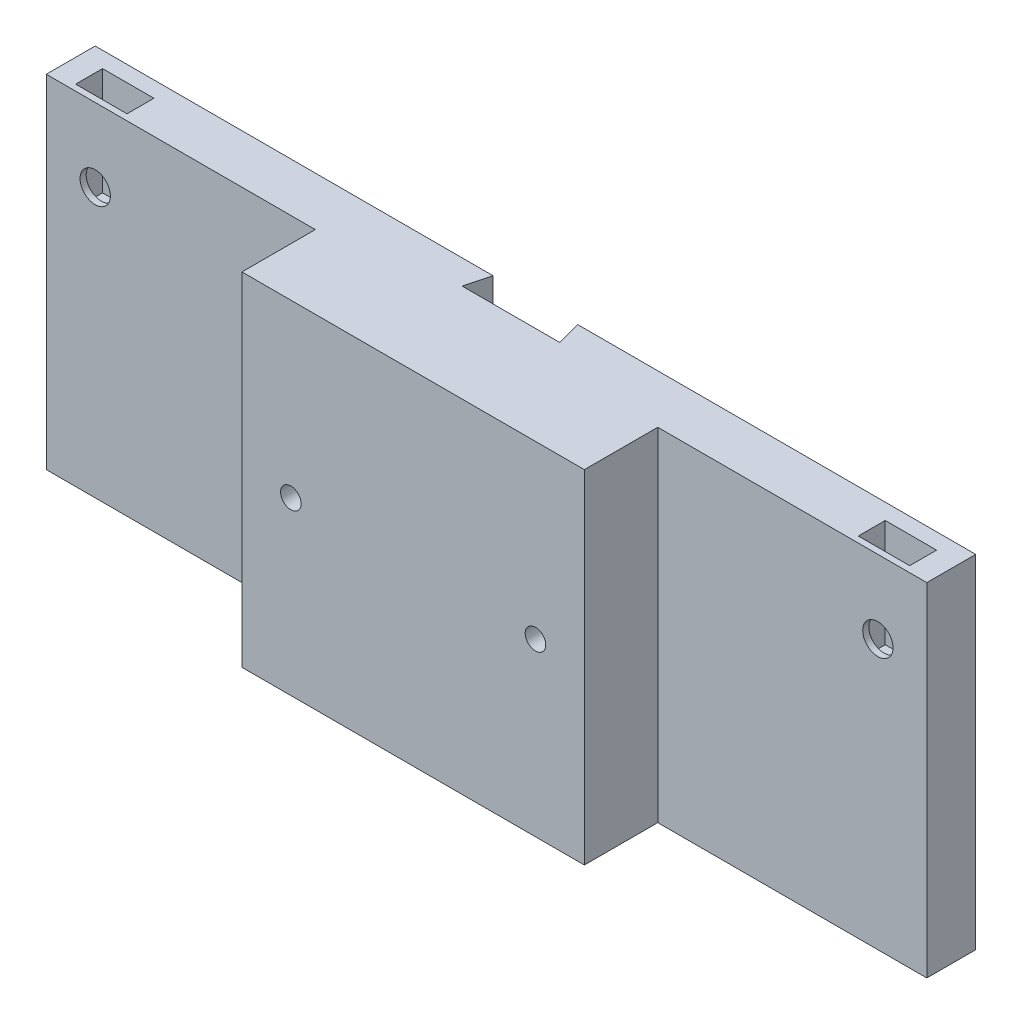
ISO-10303-21;
HEADER;
FILE_DESCRIPTION(('STEP AP214'),'2;1');
FILE_NAME('part.step','',(''),(''),'','','');
FILE_SCHEMA(('AUTOMOTIVE_DESIGN { 1 0 10303 214 1 1 1 1 }'));
ENDSEC;
DATA;
#1=APPLICATION_CONTEXT('core data for automotive mechanical design processes');
#2=APPLICATION_PROTOCOL_DEFINITION('international standard','automotive_design',2000,#1);
#3=PRODUCT_CONTEXT('',#1,'mechanical');
#4=PRODUCT('Part','Part','',(#3));
#5=PRODUCT_RELATED_PRODUCT_CATEGORY('part','',(#4));
#6=PRODUCT_DEFINITION_FORMATION('','',#4);
#7=PRODUCT_DEFINITION_CONTEXT('part definition',#1,'design');
#8=PRODUCT_DEFINITION('design','',#6,#7);
#9=PRODUCT_DEFINITION_SHAPE('','',#8);
#10=(LENGTH_UNIT() NAMED_UNIT(*) SI_UNIT(.MILLI.,.METRE.));
#11=(NAMED_UNIT(*) PLANE_ANGLE_UNIT() SI_UNIT($,.RADIAN.));
#12=(NAMED_UNIT(*) SI_UNIT($,.STERADIAN.) SOLID_ANGLE_UNIT());
#13=UNCERTAINTY_MEASURE_WITH_UNIT(LENGTH_MEASURE(1.E-05),#10,'distance_accuracy_value','');
#14=(GEOMETRIC_REPRESENTATION_CONTEXT(3) GLOBAL_UNCERTAINTY_ASSIGNED_CONTEXT((#13)) GLOBAL_UNIT_ASSIGNED_CONTEXT((#10,
#11,#12)) REPRESENTATION_CONTEXT('',''));
#15=CARTESIAN_POINT('',(0.,0.,0.));
#16=DIRECTION('',(0.,0.,1.));
#17=DIRECTION('',(1.,0.,0.));
#18=AXIS2_PLACEMENT_3D('',#15,#16,#17);
#19=CARTESIAN_POINT('',(80.,20.,25.));
#20=DIRECTION('',(0.,0.,-1.));
#21=DIRECTION('',(-1.,0.,0.));
#22=AXIS2_PLACEMENT_3D('',#19,#20,#21);
#23=CYLINDRICAL_SURFACE('',#22,3.09999999999999);
#24=CARTESIAN_POINT('',(80.,20.,3.25));
#25=DIRECTION('',(0.,0.,-1.));
#26=DIRECTION('',(-1.,0.,0.));
#27=AXIS2_PLACEMENT_3D('',#24,#25,#26);
#28=CIRCLE('',#27,3.09999999999999);
#29=CARTESIAN_POINT('',(76.9,20.,3.25));
#30=VERTEX_POINT('',#29);
#31=EDGE_CURVE('E329',#30,#30,#28,.T.);
#32=ORIENTED_EDGE('',*,*,#31,.F.);
#33=EDGE_LOOP('',(#32));
#34=FACE_BOUND('',#33,.T.);
#35=CARTESIAN_POINT('',(80.,20.,2.3));
#36=DIRECTION('',(0.,0.,-1.));
#37=DIRECTION('',(-1.,0.,0.));
#38=AXIS2_PLACEMENT_3D('',#35,#36,#37);
#39=CIRCLE('',#38,3.09999999999999);
#40=CARTESIAN_POINT('',(76.9,20.,2.3));
#41=VERTEX_POINT('',#40);
#42=EDGE_CURVE('E236',#41,#41,#39,.T.);
#43=ORIENTED_EDGE('',*,*,#42,.T.);
#44=EDGE_LOOP('',(#43));
#45=FACE_BOUND('',#44,.T.);
#46=ADVANCED_FACE('F38',(#34,#45),#23,.F.);
#47=CARTESIAN_POINT('',(-80.,20.,25.));
#48=DIRECTION('',(0.,0.,-1.));
#49=DIRECTION('',(-1.,0.,0.));
#50=AXIS2_PLACEMENT_3D('',#47,#48,#49);
#51=CYLINDRICAL_SURFACE('',#50,3.09999999999999);
#52=CARTESIAN_POINT('',(-80.,20.,2.3));
#53=DIRECTION('',(0.,0.,1.));
#54=DIRECTION('',(1.,0.,0.));
#55=AXIS2_PLACEMENT_3D('',#52,#53,#54);
#56=CIRCLE('',#55,3.09999999999999);
#57=CARTESIAN_POINT('',(-76.9,20.,2.3));
#58=VERTEX_POINT('',#57);
#59=EDGE_CURVE('E42',#58,#58,#56,.T.);
#60=ORIENTED_EDGE('',*,*,#59,.F.);
#61=EDGE_LOOP('',(#60));
#62=FACE_BOUND('',#61,.T.);
#63=CARTESIAN_POINT('',(-80.,20.,3.25000000000002));
#64=DIRECTION('',(0.,0.,-1.));
#65=DIRECTION('',(-1.,0.,0.));
#66=AXIS2_PLACEMENT_3D('',#63,#64,#65);
#67=CIRCLE('',#66,3.09999999999999);
#68=CARTESIAN_POINT('',(-83.1,20.,3.25000000000002));
#69=VERTEX_POINT('',#68);
#70=EDGE_CURVE('E328',#69,#69,#67,.T.);
#71=ORIENTED_EDGE('',*,*,#70,.F.);
#72=EDGE_LOOP('',(#71));
#73=FACE_BOUND('',#72,.T.);
#74=ADVANCED_FACE('F437',(#62,#73),#51,.F.);
#75=CARTESIAN_POINT('',(-90.,35.,25.));
#76=DIRECTION('',(1.,0.,0.));
#77=DIRECTION('',(0.,0.,-1.));
#78=AXIS2_PLACEMENT_3D('',#75,#76,#77);
#79=PLANE('',#78);
#80=DIRECTION('',(0.,-1.,0.));
#81=VECTOR('',#80,1.);
#82=CARTESIAN_POINT('',(-90.,35.,10.));
#83=LINE('',#82,#81);
#84=CARTESIAN_POINT('',(-90.,35.,10.));
#85=VERTEX_POINT('',#84);
#86=CARTESIAN_POINT('',(-90.,-35.,10.));
#87=VERTEX_POINT('',#86);
#88=EDGE_CURVE('E356',#85,#87,#83,.T.);
#89=ORIENTED_EDGE('',*,*,#88,.F.);
#90=DIRECTION('',(0.,0.,-1.));
#91=VECTOR('',#90,1.);
#92=CARTESIAN_POINT('',(-90.,35.,25.));
#93=LINE('',#92,#91);
#94=CARTESIAN_POINT('',(-90.,35.,0.));
#95=VERTEX_POINT('',#94);
#96=EDGE_CURVE('E396',#85,#95,#93,.T.);
#97=ORIENTED_EDGE('',*,*,#96,.T.);
#98=DIRECTION('',(0.,-1.,0.));
#99=VECTOR('',#98,1.);
#100=CARTESIAN_POINT('',(-90.,35.,0.));
#101=LINE('',#100,#99);
#102=CARTESIAN_POINT('',(-90.,-35.,0.));
#103=VERTEX_POINT('',#102);
#104=EDGE_CURVE('E385',#95,#103,#101,.T.);
#105=ORIENTED_EDGE('',*,*,#104,.T.);
#106=DIRECTION('',(0.,0.,-1.));
#107=VECTOR('',#106,1.);
#108=CARTESIAN_POINT('',(-90.,-35.,25.));
#109=LINE('',#108,#107);
#110=EDGE_CURVE('E11',#87,#103,#109,.T.);
#111=ORIENTED_EDGE('',*,*,#110,.F.);
#112=EDGE_LOOP('',(#89,#97,#105,#111));
#113=FACE_BOUND('',#112,.T.);
#114=ADVANCED_FACE('F40',(#113),#79,.F.);
#115=CARTESIAN_POINT('',(-80.,20.,8.75000000000002));
#116=DIRECTION('',(0.,0.,1.));
#117=DIRECTION('',(1.,0.,0.));
#118=AXIS2_PLACEMENT_3D('',#115,#116,#117);
#119=CIRCLE('',#118,3.09999999999999);
#120=CARTESIAN_POINT('',(-76.9,20.,8.75000000000002));
#121=VERTEX_POINT('',#120);
#122=EDGE_CURVE('E325',#121,#121,#119,.T.);
#123=ORIENTED_EDGE('',*,*,#122,.F.);
#124=EDGE_LOOP('',(#123));
#125=FACE_BOUND('',#124,.T.);
#126=CARTESIAN_POINT('',(-80.,20.,10.));
#127=DIRECTION('',(0.,0.,1.));
#128=DIRECTION('',(1.,0.,0.));
#129=AXIS2_PLACEMENT_3D('',#126,#127,#128);
#130=CIRCLE('',#129,3.09999999999999);
#131=CARTESIAN_POINT('',(-76.9,20.,10.));
#132=VERTEX_POINT('',#131);
#133=EDGE_CURVE('E353',#132,#132,#130,.T.);
#134=ORIENTED_EDGE('',*,*,#133,.T.);
#135=EDGE_LOOP('',(#134));
#136=FACE_BOUND('',#135,.T.);
#137=ADVANCED_FACE('F441',(#125,#136),#51,.F.);
#138=CARTESIAN_POINT('',(0.,0.,25.));
#139=DIRECTION('',(0.,0.,1.));
#140=DIRECTION('',(1.,0.,0.));
#141=AXIS2_PLACEMENT_3D('',#138,#139,#140);
#142=PLANE('',#141);
#143=DIRECTION('',(0.,-1.,0.));
#144=VECTOR('',#143,1.);
#145=CARTESIAN_POINT('',(35.,35.,25.));
#146=LINE('',#145,#144);
#147=CARTESIAN_POINT('',(35.,35.,25.));
#148=VERTEX_POINT('',#147);
#149=CARTESIAN_POINT('',(35.,-35.,25.));
#150=VERTEX_POINT('',#149);
#151=EDGE_CURVE('E337',#148,#150,#146,.T.);
#152=ORIENTED_EDGE('',*,*,#151,.F.);
#153=DIRECTION('',(-1.,0.,0.));
#154=VECTOR('',#153,1.);
#155=CARTESIAN_POINT('',(-90.,35.,25.));
#156=LINE('',#155,#154);
#157=CARTESIAN_POINT('',(-35.,35.,25.));
#158=VERTEX_POINT('',#157);
#159=EDGE_CURVE('E392',#148,#158,#156,.T.);
#160=ORIENTED_EDGE('',*,*,#159,.T.);
#161=DIRECTION('',(0.,1.,0.));
#162=VECTOR('',#161,1.);
#163=CARTESIAN_POINT('',(-35.,35.,25.));
#164=LINE('',#163,#162);
#165=CARTESIAN_POINT('',(-35.,-35.,25.));
#166=VERTEX_POINT('',#165);
#167=EDGE_CURVE('E332',#166,#158,#164,.T.);
#168=ORIENTED_EDGE('',*,*,#167,.F.);
#169=DIRECTION('',(1.,0.,0.));
#170=VECTOR('',#169,1.);
#171=CARTESIAN_POINT('',(-90.,-35.,25.));
#172=LINE('',#171,#170);
#173=EDGE_CURVE('E388',#166,#150,#172,.T.);
#174=ORIENTED_EDGE('',*,*,#173,.T.);
#175=EDGE_LOOP('',(#152,#160,#168,#174));
#176=FACE_BOUND('',#175,.T.);
#177=CARTESIAN_POINT('',(25.,0.,25.));
#178=DIRECTION('',(0.,0.,1.));
#179=DIRECTION('',(1.,0.,0.));
#180=AXIS2_PLACEMENT_3D('',#177,#178,#179);
#181=CIRCLE('',#180,2.1);
#182=CARTESIAN_POINT('',(27.1,0.,25.));
#183=VERTEX_POINT('',#182);
#184=EDGE_CURVE('E382',#183,#183,#181,.T.);
#185=ORIENTED_EDGE('',*,*,#184,.F.);
#186=EDGE_LOOP('',(#185));
#187=FACE_BOUND('',#186,.T.);
#188=CARTESIAN_POINT('',(-25.,0.,25.));
#189=DIRECTION('',(0.,0.,1.));
#190=DIRECTION('',(-1.,0.,0.));
#191=AXIS2_PLACEMENT_3D('',#188,#189,#190);
#192=CIRCLE('',#191,2.1);
#193=CARTESIAN_POINT('',(-27.1,0.,25.));
#194=VERTEX_POINT('',#193);
#195=EDGE_CURVE('E374',#194,#194,#192,.T.);
#196=ORIENTED_EDGE('',*,*,#195,.F.);
#197=EDGE_LOOP('',(#196));
#198=FACE_BOUND('',#197,.T.);
#199=ADVANCED_FACE('F577',(#176,#187,#198),#142,.T.);
#200=CARTESIAN_POINT('',(0.,0.,0.));
#201=DIRECTION('',(0.,0.,1.));
#202=DIRECTION('',(1.,0.,0.));
#203=AXIS2_PLACEMENT_3D('',#200,#201,#202);
#204=PLANE('',#203);
#205=CARTESIAN_POINT('',(80.,20.,0.));
#206=DIRECTION('',(0.,0.,-1.));
#207=DIRECTION('',(-1.,0.,0.));
#208=AXIS2_PLACEMENT_3D('',#205,#206,#207);
#209=CIRCLE('',#208,5.99999999999999);
#210=CARTESIAN_POINT('',(74.,20.,0.));
#211=VERTEX_POINT('',#210);
#212=EDGE_CURVE('E237',#211,#211,#209,.T.);
#213=ORIENTED_EDGE('',*,*,#212,.F.);
#214=EDGE_LOOP('',(#213));
#215=FACE_BOUND('',#214,.T.);
#216=CARTESIAN_POINT('',(-80.,20.,0.));
#217=DIRECTION('',(0.,0.,-1.));
#218=DIRECTION('',(1.,0.,0.));
#219=AXIS2_PLACEMENT_3D('',#216,#217,#218);
#220=CIRCLE('',#219,5.99999999999999);
#221=CARTESIAN_POINT('',(-74.,20.,0.));
#222=VERTEX_POINT('',#221);
#223=EDGE_CURVE('E228',#222,#222,#220,.T.);
#224=ORIENTED_EDGE('',*,*,#223,.F.);
#225=EDGE_LOOP('',(#224));
#226=FACE_BOUND('',#225,.T.);
#227=DIRECTION('',(-1.,0.,0.));
#228=VECTOR('',#227,1.);
#229=CARTESIAN_POINT('',(8.66025403784439,-25.,0.));
#230=LINE('',#229,#228);
#231=CARTESIAN_POINT('',(8.66025403784439,-25.,0.));
#232=VERTEX_POINT('',#231);
#233=CARTESIAN_POINT('',(-8.6602540378444,-25.,0.));
#234=VERTEX_POINT('',#233);
#235=EDGE_CURVE('E209',#232,#234,#230,.T.);
#236=ORIENTED_EDGE('',*,*,#235,.F.);
#237=DIRECTION('',(0.,1.,0.));
#238=VECTOR('',#237,1.);
#239=CARTESIAN_POINT('',(8.66025403784439,-25.,0.));
#240=LINE('',#239,#238);
#241=CARTESIAN_POINT('',(8.66025403784439,35.,0.));
#242=VERTEX_POINT('',#241);
#243=EDGE_CURVE('E192',#232,#242,#240,.T.);
#244=ORIENTED_EDGE('',*,*,#243,.T.);
#245=DIRECTION('',(-1.,0.,0.));
#246=VECTOR('',#245,1.);
#247=CARTESIAN_POINT('',(-90.,35.,0.));
#248=LINE('',#247,#246);
#249=CARTESIAN_POINT('',(90.,35.,0.));
#250=VERTEX_POINT('',#249);
#251=EDGE_CURVE('E393',#250,#242,#248,.T.);
#252=ORIENTED_EDGE('',*,*,#251,.F.);
#253=DIRECTION('',(0.,1.,0.));
#254=VECTOR('',#253,1.);
#255=CARTESIAN_POINT('',(90.,35.,0.));
#256=LINE('',#255,#254);
#257=CARTESIAN_POINT('',(90.,-35.,0.));
#258=VERTEX_POINT('',#257);
#259=EDGE_CURVE('E404',#258,#250,#256,.T.);
#260=ORIENTED_EDGE('',*,*,#259,.F.);
#261=DIRECTION('',(1.,0.,0.));
#262=VECTOR('',#261,1.);
#263=CARTESIAN_POINT('',(-90.,-35.,0.));
#264=LINE('',#263,#262);
#265=EDGE_CURVE('E400',#103,#258,#264,.T.);
#266=ORIENTED_EDGE('',*,*,#265,.F.);
#267=ORIENTED_EDGE('',*,*,#104,.F.);
#268=CARTESIAN_POINT('',(-8.66025403784443,35.,0.));
#269=VERTEX_POINT('',#268);
#270=EDGE_CURVE('E408',#269,#95,#248,.T.);
#271=ORIENTED_EDGE('',*,*,#270,.F.);
#272=DIRECTION('',(0.,1.,0.));
#273=VECTOR('',#272,1.);
#274=CARTESIAN_POINT('',(-8.6602540378444,-25.,0.));
#275=LINE('',#274,#273);
#276=EDGE_CURVE('E56',#234,#269,#275,.T.);
#277=ORIENTED_EDGE('',*,*,#276,.F.);
#278=EDGE_LOOP('',(#236,#244,#252,#260,#266,#267,#271,#277));
#279=FACE_BOUND('',#278,.T.);
#280=CARTESIAN_POINT('',(25.,0.,0.));
#281=DIRECTION('',(0.,0.,1.));
#282=DIRECTION('',(1.,0.,0.));
#283=AXIS2_PLACEMENT_3D('',#280,#281,#282);
#284=CIRCLE('',#283,2.1);
#285=CARTESIAN_POINT('',(27.1,0.,0.));
#286=VERTEX_POINT('',#285);
#287=EDGE_CURVE('E377',#286,#286,#284,.T.);
#288=ORIENTED_EDGE('',*,*,#287,.T.);
#289=EDGE_LOOP('',(#288));
#290=FACE_BOUND('',#289,.T.);
#291=CARTESIAN_POINT('',(-25.,0.,0.));
#292=DIRECTION('',(0.,0.,1.));
#293=DIRECTION('',(-1.,0.,0.));
#294=AXIS2_PLACEMENT_3D('',#291,#292,#293);
#295=CIRCLE('',#294,2.1);
#296=CARTESIAN_POINT('',(-27.1,0.,0.));
#297=VERTEX_POINT('',#296);
#298=EDGE_CURVE('E378',#297,#297,#295,.T.);
#299=ORIENTED_EDGE('',*,*,#298,.T.);
#300=EDGE_LOOP('',(#299));
#301=FACE_BOUND('',#300,.T.);
#302=ADVANCED_FACE('F213',(#215,#226,#279,#290,#301),#204,.F.);
#303=CARTESIAN_POINT('',(-90.,-35.,25.));
#304=DIRECTION('',(0.,1.,0.));
#305=DIRECTION('',(-1.,0.,0.));
#306=AXIS2_PLACEMENT_3D('',#303,#304,#305);
#307=PLANE('',#306);
#308=DIRECTION('',(1.,0.,0.));
#309=VECTOR('',#308,1.);
#310=CARTESIAN_POINT('',(90.,-35.,10.));
#311=LINE('',#310,#309);
#312=CARTESIAN_POINT('',(35.,-35.,10.));
#313=VERTEX_POINT('',#312);
#314=CARTESIAN_POINT('',(90.,-35.,10.));
#315=VERTEX_POINT('',#314);
#316=EDGE_CURVE('E345',#313,#315,#311,.T.);
#317=ORIENTED_EDGE('',*,*,#316,.F.);
#318=DIRECTION('',(0.,0.,1.));
#319=VECTOR('',#318,1.);
#320=CARTESIAN_POINT('',(35.,-35.,10.));
#321=LINE('',#320,#319);
#322=EDGE_CURVE('E350',#313,#150,#321,.T.);
#323=ORIENTED_EDGE('',*,*,#322,.T.);
#324=ORIENTED_EDGE('',*,*,#173,.F.);
#325=DIRECTION('',(0.,0.,1.));
#326=VECTOR('',#325,1.);
#327=CARTESIAN_POINT('',(-35.,-35.,10.));
#328=LINE('',#327,#326);
#329=CARTESIAN_POINT('',(-35.,-35.,10.));
#330=VERTEX_POINT('',#329);
#331=EDGE_CURVE('E367',#330,#166,#328,.T.);
#332=ORIENTED_EDGE('',*,*,#331,.F.);
#333=DIRECTION('',(1.,0.,0.));
#334=VECTOR('',#333,1.);
#335=CARTESIAN_POINT('',(-90.,-35.,10.));
#336=LINE('',#335,#334);
#337=EDGE_CURVE('E359',#87,#330,#336,.T.);
#338=ORIENTED_EDGE('',*,*,#337,.F.);
#339=ORIENTED_EDGE('',*,*,#110,.T.);
#340=ORIENTED_EDGE('',*,*,#265,.T.);
#341=DIRECTION('',(0.,0.,-1.));
#342=VECTOR('',#341,1.);
#343=CARTESIAN_POINT('',(90.,-35.,25.));
#344=LINE('',#343,#342);
#345=EDGE_CURVE('E48',#315,#258,#344,.T.);
#346=ORIENTED_EDGE('',*,*,#345,.F.);
#347=EDGE_LOOP('',(#317,#323,#324,#332,#338,#339,#340,#346));
#348=FACE_BOUND('',#347,.T.);
#349=ADVANCED_FACE('F597',(#348),#307,.F.);
#350=CARTESIAN_POINT('',(90.,35.,25.));
#351=DIRECTION('',(-1.,0.,0.));
#352=DIRECTION('',(0.,-1.,0.));
#353=AXIS2_PLACEMENT_3D('',#350,#351,#352);
#354=PLANE('',#353);
#355=DIRECTION('',(0.,0.,-1.));
#356=VECTOR('',#355,1.);
#357=CARTESIAN_POINT('',(90.,35.,25.));
#358=LINE('',#357,#356);
#359=CARTESIAN_POINT('',(90.,35.,10.));
#360=VERTEX_POINT('',#359);
#361=EDGE_CURVE('E413',#360,#250,#358,.T.);
#362=ORIENTED_EDGE('',*,*,#361,.F.);
#363=DIRECTION('',(0.,1.,0.));
#364=VECTOR('',#363,1.);
#365=CARTESIAN_POINT('',(90.,35.,10.));
#366=LINE('',#365,#364);
#367=EDGE_CURVE('E333',#315,#360,#366,.T.);
#368=ORIENTED_EDGE('',*,*,#367,.F.);
#369=ORIENTED_EDGE('',*,*,#345,.T.);
#370=ORIENTED_EDGE('',*,*,#259,.T.);
#371=EDGE_LOOP('',(#362,#368,#369,#370));
#372=FACE_BOUND('',#371,.T.);
#373=ADVANCED_FACE('F515',(#372),#354,.F.);
#374=CARTESIAN_POINT('',(-90.,35.,25.));
#375=DIRECTION('',(0.,-1.,0.));
#376=DIRECTION('',(1.,0.,0.));
#377=AXIS2_PLACEMENT_3D('',#374,#375,#376);
#378=PLANE('',#377);
#379=DIRECTION('',(1.,0.,0.));
#380=VECTOR('',#379,1.);
#381=CARTESIAN_POINT('',(74.75,35.,8.75));
#382=LINE('',#381,#380);
#383=CARTESIAN_POINT('',(74.75,35.,8.75));
#384=VERTEX_POINT('',#383);
#385=CARTESIAN_POINT('',(85.25,35.,8.75));
#386=VERTEX_POINT('',#385);
#387=EDGE_CURVE('E267',#384,#386,#382,.T.);
#388=ORIENTED_EDGE('',*,*,#387,.F.);
#389=DIRECTION('',(0.,0.,1.));
#390=VECTOR('',#389,1.);
#391=CARTESIAN_POINT('',(74.75,35.,3.25));
#392=LINE('',#391,#390);
#393=CARTESIAN_POINT('',(74.75,35.,3.25));
#394=VERTEX_POINT('',#393);
#395=EDGE_CURVE('E67',#394,#384,#392,.T.);
#396=ORIENTED_EDGE('',*,*,#395,.F.);
#397=DIRECTION('',(-1.,0.,0.));
#398=VECTOR('',#397,1.);
#399=CARTESIAN_POINT('',(74.75,35.,3.25));
#400=LINE('',#399,#398);
#401=CARTESIAN_POINT('',(85.25,35.,3.25));
#402=VERTEX_POINT('',#401);
#403=EDGE_CURVE('E252',#402,#394,#400,.T.);
#404=ORIENTED_EDGE('',*,*,#403,.F.);
#405=DIRECTION('',(0.,0.,-1.));
#406=VECTOR('',#405,1.);
#407=CARTESIAN_POINT('',(85.25,35.,3.25));
#408=LINE('',#407,#406);
#409=EDGE_CURVE('E272',#386,#402,#408,.T.);
#410=ORIENTED_EDGE('',*,*,#409,.F.);
#411=EDGE_LOOP('',(#388,#396,#404,#410));
#412=FACE_BOUND('',#411,.T.);
#413=DIRECTION('',(0.,0.,1.));
#414=VECTOR('',#413,1.);
#415=CARTESIAN_POINT('',(-85.25,35.,3.25000000000003));
#416=LINE('',#415,#414);
#417=CARTESIAN_POINT('',(-85.25,35.,3.25000000000003));
#418=VERTEX_POINT('',#417);
#419=CARTESIAN_POINT('',(-85.25,35.,8.75000000000002));
#420=VERTEX_POINT('',#419);
#421=EDGE_CURVE('E309',#418,#420,#416,.T.);
#422=ORIENTED_EDGE('',*,*,#421,.F.);
#423=DIRECTION('',(-1.,0.,0.));
#424=VECTOR('',#423,1.);
#425=CARTESIAN_POINT('',(-74.75,35.,3.25000000000002));
#426=LINE('',#425,#424);
#427=CARTESIAN_POINT('',(-74.75,35.,3.25000000000002));
#428=VERTEX_POINT('',#427);
#429=EDGE_CURVE('E307',#428,#418,#426,.T.);
#430=ORIENTED_EDGE('',*,*,#429,.F.);
#431=DIRECTION('',(0.,0.,-1.));
#432=VECTOR('',#431,1.);
#433=CARTESIAN_POINT('',(-74.75,35.,3.25000000000002));
#434=LINE('',#433,#432);
#435=CARTESIAN_POINT('',(-74.75,35.,8.75000000000002));
#436=VERTEX_POINT('',#435);
#437=EDGE_CURVE('E296',#436,#428,#434,.T.);
#438=ORIENTED_EDGE('',*,*,#437,.F.);
#439=DIRECTION('',(1.,0.,0.));
#440=VECTOR('',#439,1.);
#441=CARTESIAN_POINT('',(-74.75,35.,8.75000000000002));
#442=LINE('',#441,#440);
#443=EDGE_CURVE('E312',#420,#436,#442,.T.);
#444=ORIENTED_EDGE('',*,*,#443,.F.);
#445=EDGE_LOOP('',(#422,#430,#438,#444));
#446=FACE_BOUND('',#445,.T.);
#447=ORIENTED_EDGE('',*,*,#251,.T.);
#448=DIRECTION('',(-0.25881904510252,0.,-0.965925826289069));
#449=VECTOR('',#448,1.);
#450=CARTESIAN_POINT('',(8.66025403784439,35.,0.));
#451=LINE('',#450,#449);
#452=CARTESIAN_POINT('',(9.99999999999999,35.,5.));
#453=VERTEX_POINT('',#452);
#454=EDGE_CURVE('E198',#453,#242,#451,.T.);
#455=ORIENTED_EDGE('',*,*,#454,.F.);
#456=DIRECTION('',(1.,0.,0.));
#457=VECTOR('',#456,1.);
#458=CARTESIAN_POINT('',(-10.,35.,5.));
#459=LINE('',#458,#457);
#460=CARTESIAN_POINT('',(-10.,35.,5.));
#461=VERTEX_POINT('',#460);
#462=EDGE_CURVE('E211',#461,#453,#459,.T.);
#463=ORIENTED_EDGE('',*,*,#462,.F.);
#464=DIRECTION('',(-0.258819045102517,0.,0.965925826289069));
#465=VECTOR('',#464,1.);
#466=CARTESIAN_POINT('',(-8.6602540378444,35.,0.));
#467=LINE('',#466,#465);
#468=EDGE_CURVE('E222',#269,#461,#467,.T.);
#469=ORIENTED_EDGE('',*,*,#468,.F.);
#470=ORIENTED_EDGE('',*,*,#270,.T.);
#471=ORIENTED_EDGE('',*,*,#96,.F.);
#472=DIRECTION('',(-1.,0.,0.));
#473=VECTOR('',#472,1.);
#474=CARTESIAN_POINT('',(-90.,35.,10.));
#475=LINE('',#474,#473);
#476=CARTESIAN_POINT('',(-35.,35.,10.));
#477=VERTEX_POINT('',#476);
#478=EDGE_CURVE('E365',#477,#85,#475,.T.);
#479=ORIENTED_EDGE('',*,*,#478,.F.);
#480=DIRECTION('',(0.,0.,1.));
#481=VECTOR('',#480,1.);
#482=CARTESIAN_POINT('',(-35.,35.,10.));
#483=LINE('',#482,#481);
#484=EDGE_CURVE('E349',#477,#158,#483,.T.);
#485=ORIENTED_EDGE('',*,*,#484,.T.);
#486=ORIENTED_EDGE('',*,*,#159,.F.);
#487=DIRECTION('',(0.,0.,1.));
#488=VECTOR('',#487,1.);
#489=CARTESIAN_POINT('',(35.,35.,10.));
#490=LINE('',#489,#488);
#491=CARTESIAN_POINT('',(35.,35.,10.));
#492=VERTEX_POINT('',#491);
#493=EDGE_CURVE('E347',#492,#148,#490,.T.);
#494=ORIENTED_EDGE('',*,*,#493,.F.);
#495=DIRECTION('',(-1.,0.,0.));
#496=VECTOR('',#495,1.);
#497=CARTESIAN_POINT('',(90.,35.,10.));
#498=LINE('',#497,#496);
#499=EDGE_CURVE('E336',#360,#492,#498,.T.);
#500=ORIENTED_EDGE('',*,*,#499,.F.);
#501=ORIENTED_EDGE('',*,*,#361,.T.);
#502=EDGE_LOOP('',(#447,#455,#463,#469,#470,#471,#479,#485,#486,#494,#500,#501));
#503=FACE_BOUND('',#502,.T.);
#504=ADVANCED_FACE('F459',(#412,#446,#503),#378,.F.);
#505=CARTESIAN_POINT('',(25.,0.,25.));
#506=DIRECTION('',(0.,0.,-1.));
#507=DIRECTION('',(-1.,0.,0.));
#508=AXIS2_PLACEMENT_3D('',#505,#506,#507);
#509=CYLINDRICAL_SURFACE('',#508,2.1);
#510=ORIENTED_EDGE('',*,*,#184,.T.);
#511=EDGE_LOOP('',(#510));
#512=FACE_BOUND('',#511,.T.);
#513=ORIENTED_EDGE('',*,*,#287,.F.);
#514=EDGE_LOOP('',(#513));
#515=FACE_BOUND('',#514,.T.);
#516=ADVANCED_FACE('F495',(#512,#515),#509,.F.);
#517=CARTESIAN_POINT('',(-25.,0.,25.));
#518=DIRECTION('',(0.,0.,-1.));
#519=DIRECTION('',(-1.,0.,0.));
#520=AXIS2_PLACEMENT_3D('',#517,#518,#519);
#521=CYLINDRICAL_SURFACE('',#520,2.1);
#522=ORIENTED_EDGE('',*,*,#195,.T.);
#523=EDGE_LOOP('',(#522));
#524=FACE_BOUND('',#523,.T.);
#525=ORIENTED_EDGE('',*,*,#298,.F.);
#526=EDGE_LOOP('',(#525));
#527=FACE_BOUND('',#526,.T.);
#528=ADVANCED_FACE('F486',(#524,#527),#521,.F.);
#529=CARTESIAN_POINT('',(80.,20.,8.75));
#530=DIRECTION('',(0.,0.,1.));
#531=DIRECTION('',(1.,0.,0.));
#532=AXIS2_PLACEMENT_3D('',#529,#530,#531);
#533=CIRCLE('',#532,3.09999999999999);
#534=CARTESIAN_POINT('',(83.1,20.,8.75));
#535=VERTEX_POINT('',#534);
#536=EDGE_CURVE('E282',#535,#535,#533,.T.);
#537=ORIENTED_EDGE('',*,*,#536,.F.);
#538=EDGE_LOOP('',(#537));
#539=FACE_BOUND('',#538,.T.);
#540=CARTESIAN_POINT('',(80.,20.,10.));
#541=DIRECTION('',(0.,0.,-1.));
#542=DIRECTION('',(-1.,0.,0.));
#543=AXIS2_PLACEMENT_3D('',#540,#541,#542);
#544=CIRCLE('',#543,3.09999999999999);
#545=CARTESIAN_POINT('',(76.9,20.,10.));
#546=VERTEX_POINT('',#545);
#547=EDGE_CURVE('E381',#546,#546,#544,.T.);
#548=ORIENTED_EDGE('',*,*,#547,.F.);
#549=EDGE_LOOP('',(#548));
#550=FACE_BOUND('',#549,.T.);
#551=ADVANCED_FACE('F479',(#539,#550),#23,.F.);
#552=CARTESIAN_POINT('',(-35.,35.,10.));
#553=DIRECTION('',(1.,0.,0.));
#554=DIRECTION('',(0.,1.,0.));
#555=AXIS2_PLACEMENT_3D('',#552,#553,#554);
#556=PLANE('',#555);
#557=ORIENTED_EDGE('',*,*,#167,.T.);
#558=ORIENTED_EDGE('',*,*,#484,.F.);
#559=DIRECTION('',(0.,1.,0.));
#560=VECTOR('',#559,1.);
#561=CARTESIAN_POINT('',(-35.,35.,10.));
#562=LINE('',#561,#560);
#563=EDGE_CURVE('E363',#330,#477,#562,.T.);
#564=ORIENTED_EDGE('',*,*,#563,.F.);
#565=ORIENTED_EDGE('',*,*,#331,.T.);
#566=EDGE_LOOP('',(#557,#558,#564,#565));
#567=FACE_BOUND('',#566,.T.);
#568=ADVANCED_FACE('F485',(#567),#556,.F.);
#569=CARTESIAN_POINT('',(0.,0.,10.));
#570=DIRECTION('',(0.,0.,1.));
#571=DIRECTION('',(1.,0.,0.));
#572=AXIS2_PLACEMENT_3D('',#569,#570,#571);
#573=PLANE('',#572);
#574=ORIENTED_EDGE('',*,*,#133,.F.);
#575=EDGE_LOOP('',(#574));
#576=FACE_BOUND('',#575,.T.);
#577=ORIENTED_EDGE('',*,*,#88,.T.);
#578=ORIENTED_EDGE('',*,*,#337,.T.);
#579=ORIENTED_EDGE('',*,*,#563,.T.);
#580=ORIENTED_EDGE('',*,*,#478,.T.);
#581=EDGE_LOOP('',(#577,#578,#579,#580));
#582=FACE_BOUND('',#581,.T.);
#583=ADVANCED_FACE('F492',(#576,#582),#573,.T.);
#584=CARTESIAN_POINT('',(35.,35.,10.));
#585=DIRECTION('',(-1.,0.,0.));
#586=DIRECTION('',(0.,-1.,0.));
#587=AXIS2_PLACEMENT_3D('',#584,#585,#586);
#588=PLANE('',#587);
#589=ORIENTED_EDGE('',*,*,#151,.T.);
#590=ORIENTED_EDGE('',*,*,#322,.F.);
#591=DIRECTION('',(0.,-1.,0.));
#592=VECTOR('',#591,1.);
#593=CARTESIAN_POINT('',(35.,35.,10.));
#594=LINE('',#593,#592);
#595=EDGE_CURVE('E341',#492,#313,#594,.T.);
#596=ORIENTED_EDGE('',*,*,#595,.F.);
#597=ORIENTED_EDGE('',*,*,#493,.T.);
#598=EDGE_LOOP('',(#589,#590,#596,#597));
#599=FACE_BOUND('',#598,.T.);
#600=ADVANCED_FACE('F505',(#599),#588,.F.);
#601=CARTESIAN_POINT('',(0.,0.,10.));
#602=DIRECTION('',(0.,0.,-1.));
#603=DIRECTION('',(-1.,0.,0.));
#604=AXIS2_PLACEMENT_3D('',#601,#602,#603);
#605=PLANE('',#604);
#606=ORIENTED_EDGE('',*,*,#547,.T.);
#607=EDGE_LOOP('',(#606));
#608=FACE_BOUND('',#607,.T.);
#609=ORIENTED_EDGE('',*,*,#367,.T.);
#610=ORIENTED_EDGE('',*,*,#499,.T.);
#611=ORIENTED_EDGE('',*,*,#595,.T.);
#612=ORIENTED_EDGE('',*,*,#316,.T.);
#613=EDGE_LOOP('',(#609,#610,#611,#612));
#614=FACE_BOUND('',#613,.T.);
#615=ADVANCED_FACE('F501',(#608,#614),#605,.F.);
#616=CARTESIAN_POINT('',(74.75,13.,3.25));
#617=DIRECTION('',(-1.,0.,0.));
#618=DIRECTION('',(0.,-1.,0.));
#619=AXIS2_PLACEMENT_3D('',#616,#617,#618);
#620=PLANE('',#619);
#621=ORIENTED_EDGE('',*,*,#395,.T.);
#622=DIRECTION('',(0.,1.,0.));
#623=VECTOR('',#622,1.);
#624=CARTESIAN_POINT('',(74.75,13.,8.75));
#625=LINE('',#624,#623);
#626=CARTESIAN_POINT('',(74.75,13.,8.75));
#627=VERTEX_POINT('',#626);
#628=EDGE_CURVE('E264',#627,#384,#625,.T.);
#629=ORIENTED_EDGE('',*,*,#628,.F.);
#630=DIRECTION('',(0.,0.,1.));
#631=VECTOR('',#630,1.);
#632=CARTESIAN_POINT('',(74.75,13.,3.25));
#633=LINE('',#632,#631);
#634=CARTESIAN_POINT('',(74.75,13.,3.25));
#635=VERTEX_POINT('',#634);
#636=EDGE_CURVE('E247',#635,#627,#633,.T.);
#637=ORIENTED_EDGE('',*,*,#636,.F.);
#638=DIRECTION('',(0.,1.,0.));
#639=VECTOR('',#638,1.);
#640=CARTESIAN_POINT('',(74.75,13.,3.25));
#641=LINE('',#640,#639);
#642=EDGE_CURVE('E279',#635,#394,#641,.T.);
#643=ORIENTED_EDGE('',*,*,#642,.T.);
#644=EDGE_LOOP('',(#621,#629,#637,#643));
#645=FACE_BOUND('',#644,.T.);
#646=ADVANCED_FACE('F504',(#645),#620,.F.);
#647=CARTESIAN_POINT('',(74.75,13.,3.25));
#648=DIRECTION('',(0.,0.,-1.));
#649=DIRECTION('',(-1.,0.,0.));
#650=AXIS2_PLACEMENT_3D('',#647,#648,#649);
#651=PLANE('',#650);
#652=ORIENTED_EDGE('',*,*,#31,.T.);
#653=EDGE_LOOP('',(#652));
#654=FACE_BOUND('',#653,.T.);
#655=ORIENTED_EDGE('',*,*,#403,.T.);
#656=ORIENTED_EDGE('',*,*,#642,.F.);
#657=DIRECTION('',(-1.,0.,0.));
#658=VECTOR('',#657,1.);
#659=CARTESIAN_POINT('',(74.75,13.,3.25));
#660=LINE('',#659,#658);
#661=CARTESIAN_POINT('',(85.25,13.,3.25));
#662=VERTEX_POINT('',#661);
#663=EDGE_CURVE('E260',#662,#635,#660,.T.);
#664=ORIENTED_EDGE('',*,*,#663,.F.);
#665=DIRECTION('',(0.,1.,0.));
#666=VECTOR('',#665,1.);
#667=CARTESIAN_POINT('',(85.25,13.,3.25));
#668=LINE('',#667,#666);
#669=EDGE_CURVE('E283',#662,#402,#668,.T.);
#670=ORIENTED_EDGE('',*,*,#669,.T.);
#671=EDGE_LOOP('',(#655,#656,#664,#670));
#672=FACE_BOUND('',#671,.T.);
#673=ADVANCED_FACE('F551',(#654,#672),#651,.F.);
#674=CARTESIAN_POINT('',(85.25,13.,3.25));
#675=DIRECTION('',(1.,0.,0.));
#676=DIRECTION('',(0.,1.,0.));
#677=AXIS2_PLACEMENT_3D('',#674,#675,#676);
#678=PLANE('',#677);
#679=ORIENTED_EDGE('',*,*,#409,.T.);
#680=ORIENTED_EDGE('',*,*,#669,.F.);
#681=DIRECTION('',(0.,0.,-1.));
#682=VECTOR('',#681,1.);
#683=CARTESIAN_POINT('',(85.25,13.,3.25));
#684=LINE('',#683,#682);
#685=CARTESIAN_POINT('',(85.25,13.,8.75));
#686=VERTEX_POINT('',#685);
#687=EDGE_CURVE('E256',#686,#662,#684,.T.);
#688=ORIENTED_EDGE('',*,*,#687,.F.);
#689=DIRECTION('',(0.,1.,0.));
#690=VECTOR('',#689,1.);
#691=CARTESIAN_POINT('',(85.25,13.,8.75));
#692=LINE('',#691,#690);
#693=EDGE_CURVE('E286',#686,#386,#692,.T.);
#694=ORIENTED_EDGE('',*,*,#693,.T.);
#695=EDGE_LOOP('',(#679,#680,#688,#694));
#696=FACE_BOUND('',#695,.T.);
#697=ADVANCED_FACE('F554',(#696),#678,.F.);
#698=CARTESIAN_POINT('',(74.75,13.,8.75));
#699=DIRECTION('',(0.,0.,1.));
#700=DIRECTION('',(1.,0.,0.));
#701=AXIS2_PLACEMENT_3D('',#698,#699,#700);
#702=PLANE('',#701);
#703=ORIENTED_EDGE('',*,*,#536,.T.);
#704=EDGE_LOOP('',(#703));
#705=FACE_BOUND('',#704,.T.);
#706=ORIENTED_EDGE('',*,*,#387,.T.);
#707=ORIENTED_EDGE('',*,*,#693,.F.);
#708=DIRECTION('',(1.,0.,0.));
#709=VECTOR('',#708,1.);
#710=CARTESIAN_POINT('',(74.75,13.,8.75));
#711=LINE('',#710,#709);
#712=EDGE_CURVE('E251',#627,#686,#711,.T.);
#713=ORIENTED_EDGE('',*,*,#712,.F.);
#714=ORIENTED_EDGE('',*,*,#628,.T.);
#715=EDGE_LOOP('',(#706,#707,#713,#714));
#716=FACE_BOUND('',#715,.T.);
#717=ADVANCED_FACE('F549',(#705,#716),#702,.F.);
#718=CARTESIAN_POINT('',(0.,13.,0.));
#719=DIRECTION('',(0.,1.,0.));
#720=DIRECTION('',(0.,0.,1.));
#721=AXIS2_PLACEMENT_3D('',#718,#719,#720);
#722=PLANE('',#721);
#723=ORIENTED_EDGE('',*,*,#636,.T.);
#724=ORIENTED_EDGE('',*,*,#712,.T.);
#725=ORIENTED_EDGE('',*,*,#687,.T.);
#726=ORIENTED_EDGE('',*,*,#663,.T.);
#727=EDGE_LOOP('',(#723,#724,#725,#726));
#728=FACE_BOUND('',#727,.T.);
#729=ADVANCED_FACE('F448',(#728),#722,.T.);
#730=CARTESIAN_POINT('',(-74.75,13.,3.25000000000002));
#731=DIRECTION('',(0.,0.,-1.));
#732=DIRECTION('',(-1.,0.,0.));
#733=AXIS2_PLACEMENT_3D('',#730,#731,#732);
#734=PLANE('',#733);
#735=ORIENTED_EDGE('',*,*,#70,.T.);
#736=EDGE_LOOP('',(#735));
#737=FACE_BOUND('',#736,.T.);
#738=ORIENTED_EDGE('',*,*,#429,.T.);
#739=DIRECTION('',(0.,1.,0.));
#740=VECTOR('',#739,1.);
#741=CARTESIAN_POINT('',(-85.25,13.,3.25000000000003));
#742=LINE('',#741,#740);
#743=CARTESIAN_POINT('',(-85.25,13.,3.25000000000003));
#744=VERTEX_POINT('',#743);
#745=EDGE_CURVE('E306',#744,#418,#742,.T.);
#746=ORIENTED_EDGE('',*,*,#745,.F.);
#747=DIRECTION('',(-1.,0.,0.));
#748=VECTOR('',#747,1.);
#749=CARTESIAN_POINT('',(-74.75,13.,3.25000000000002));
#750=LINE('',#749,#748);
#751=CARTESIAN_POINT('',(-74.75,13.,3.25000000000002));
#752=VERTEX_POINT('',#751);
#753=EDGE_CURVE('E291',#752,#744,#750,.T.);
#754=ORIENTED_EDGE('',*,*,#753,.F.);
#755=DIRECTION('',(0.,1.,0.));
#756=VECTOR('',#755,1.);
#757=CARTESIAN_POINT('',(-74.75,13.,3.25000000000002));
#758=LINE('',#757,#756);
#759=EDGE_CURVE('E268',#752,#428,#758,.T.);
#760=ORIENTED_EDGE('',*,*,#759,.T.);
#761=EDGE_LOOP('',(#738,#746,#754,#760));
#762=FACE_BOUND('',#761,.T.);
#763=ADVANCED_FACE('F444',(#737,#762),#734,.F.);
#764=CARTESIAN_POINT('',(-74.75,13.,3.25000000000002));
#765=DIRECTION('',(1.,0.,0.));
#766=DIRECTION('',(0.,1.,0.));
#767=AXIS2_PLACEMENT_3D('',#764,#765,#766);
#768=PLANE('',#767);
#769=ORIENTED_EDGE('',*,*,#437,.T.);
#770=ORIENTED_EDGE('',*,*,#759,.F.);
#771=DIRECTION('',(0.,0.,-1.));
#772=VECTOR('',#771,1.);
#773=CARTESIAN_POINT('',(-74.75,13.,3.25000000000002));
#774=LINE('',#773,#772);
#775=CARTESIAN_POINT('',(-74.75,13.,8.75000000000002));
#776=VERTEX_POINT('',#775);
#777=EDGE_CURVE('E302',#776,#752,#774,.T.);
#778=ORIENTED_EDGE('',*,*,#777,.F.);
#779=DIRECTION('',(0.,1.,0.));
#780=VECTOR('',#779,1.);
#781=CARTESIAN_POINT('',(-74.75,13.,8.75000000000002));
#782=LINE('',#781,#780);
#783=EDGE_CURVE('E319',#776,#436,#782,.T.);
#784=ORIENTED_EDGE('',*,*,#783,.T.);
#785=EDGE_LOOP('',(#769,#770,#778,#784));
#786=FACE_BOUND('',#785,.T.);
#787=ADVANCED_FACE('F447',(#786),#768,.F.);
#788=CARTESIAN_POINT('',(-74.75,13.,8.75000000000002));
#789=DIRECTION('',(0.,0.,1.));
#790=DIRECTION('',(1.,0.,0.));
#791=AXIS2_PLACEMENT_3D('',#788,#789,#790);
#792=PLANE('',#791);
#793=ORIENTED_EDGE('',*,*,#122,.T.);
#794=EDGE_LOOP('',(#793));
#795=FACE_BOUND('',#794,.T.);
#796=ORIENTED_EDGE('',*,*,#443,.T.);
#797=ORIENTED_EDGE('',*,*,#783,.F.);
#798=DIRECTION('',(1.,0.,0.));
#799=VECTOR('',#798,1.);
#800=CARTESIAN_POINT('',(-74.75,13.,8.75000000000002));
#801=LINE('',#800,#799);
#802=CARTESIAN_POINT('',(-85.25,13.,8.75000000000002));
#803=VERTEX_POINT('',#802);
#804=EDGE_CURVE('E299',#803,#776,#801,.T.);
#805=ORIENTED_EDGE('',*,*,#804,.F.);
#806=DIRECTION('',(0.,1.,0.));
#807=VECTOR('',#806,1.);
#808=CARTESIAN_POINT('',(-85.25,13.,8.75000000000002));
#809=LINE('',#808,#807);
#810=EDGE_CURVE('E321',#803,#420,#809,.T.);
#811=ORIENTED_EDGE('',*,*,#810,.T.);
#812=EDGE_LOOP('',(#796,#797,#805,#811));
#813=FACE_BOUND('',#812,.T.);
#814=ADVANCED_FACE('F462',(#795,#813),#792,.F.);
#815=CARTESIAN_POINT('',(-85.25,13.,3.25000000000003));
#816=DIRECTION('',(-1.,0.,0.));
#817=DIRECTION('',(0.,-1.,0.));
#818=AXIS2_PLACEMENT_3D('',#815,#816,#817);
#819=PLANE('',#818);
#820=ORIENTED_EDGE('',*,*,#421,.T.);
#821=ORIENTED_EDGE('',*,*,#810,.F.);
#822=DIRECTION('',(0.,0.,1.));
#823=VECTOR('',#822,1.);
#824=CARTESIAN_POINT('',(-85.25,13.,3.25000000000003));
#825=LINE('',#824,#823);
#826=EDGE_CURVE('E295',#744,#803,#825,.T.);
#827=ORIENTED_EDGE('',*,*,#826,.F.);
#828=ORIENTED_EDGE('',*,*,#745,.T.);
#829=EDGE_LOOP('',(#820,#821,#827,#828));
#830=FACE_BOUND('',#829,.T.);
#831=ADVANCED_FACE('F457',(#830),#819,.F.);
#832=CARTESIAN_POINT('',(0.,13.,0.));
#833=DIRECTION('',(0.,1.,0.));
#834=DIRECTION('',(0.,0.,1.));
#835=AXIS2_PLACEMENT_3D('',#832,#833,#834);
#836=PLANE('',#835);
#837=ORIENTED_EDGE('',*,*,#753,.T.);
#838=ORIENTED_EDGE('',*,*,#826,.T.);
#839=ORIENTED_EDGE('',*,*,#804,.T.);
#840=ORIENTED_EDGE('',*,*,#777,.T.);
#841=EDGE_LOOP('',(#837,#838,#839,#840));
#842=FACE_BOUND('',#841,.T.);
#843=ADVANCED_FACE('F466',(#842),#836,.T.);
#844=CARTESIAN_POINT('',(-80.,20.,2.3));
#845=DIRECTION('',(0.,0.,-1.));
#846=DIRECTION('',(-1.,0.,0.));
#847=AXIS2_PLACEMENT_3D('',#844,#845,#846);
#848=CYLINDRICAL_SURFACE('',#847,5.99999999999999);
#849=CARTESIAN_POINT('',(-80.,20.,2.3));
#850=DIRECTION('',(0.,0.,-1.));
#851=DIRECTION('',(1.,0.,0.));
#852=AXIS2_PLACEMENT_3D('',#849,#850,#851);
#853=CIRCLE('',#852,5.99999999999999);
#854=CARTESIAN_POINT('',(-74.,20.,2.3));
#855=VERTEX_POINT('',#854);
#856=EDGE_CURVE('E241',#855,#855,#853,.T.);
#857=ORIENTED_EDGE('',*,*,#856,.F.);
#858=EDGE_LOOP('',(#857));
#859=FACE_BOUND('',#858,.T.);
#860=ORIENTED_EDGE('',*,*,#223,.T.);
#861=EDGE_LOOP('',(#860));
#862=FACE_BOUND('',#861,.T.);
#863=ADVANCED_FACE('F543',(#859,#862),#848,.F.);
#864=CARTESIAN_POINT('',(-80.,20.,2.3));
#865=DIRECTION('',(0.,0.,1.));
#866=DIRECTION('',(1.,0.,0.));
#867=AXIS2_PLACEMENT_3D('',#864,#865,#866);
#868=PLANE('',#867);
#869=ORIENTED_EDGE('',*,*,#59,.T.);
#870=EDGE_LOOP('',(#869));
#871=FACE_BOUND('',#870,.T.);
#872=ORIENTED_EDGE('',*,*,#856,.T.);
#873=EDGE_LOOP('',(#872));
#874=FACE_BOUND('',#873,.T.);
#875=ADVANCED_FACE('F434',(#871,#874),#868,.F.);
#876=CARTESIAN_POINT('',(80.,20.,2.3));
#877=DIRECTION('',(0.,0.,-1.));
#878=DIRECTION('',(-1.,0.,0.));
#879=AXIS2_PLACEMENT_3D('',#876,#877,#878);
#880=CYLINDRICAL_SURFACE('',#879,5.99999999999999);
#881=CARTESIAN_POINT('',(80.,20.,2.3));
#882=DIRECTION('',(0.,0.,-1.));
#883=DIRECTION('',(-1.,0.,0.));
#884=AXIS2_PLACEMENT_3D('',#881,#882,#883);
#885=CIRCLE('',#884,5.99999999999999);
#886=CARTESIAN_POINT('',(74.,20.,2.3));
#887=VERTEX_POINT('',#886);
#888=EDGE_CURVE('E232',#887,#887,#885,.T.);
#889=ORIENTED_EDGE('',*,*,#888,.F.);
#890=EDGE_LOOP('',(#889));
#891=FACE_BOUND('',#890,.T.);
#892=ORIENTED_EDGE('',*,*,#212,.T.);
#893=EDGE_LOOP('',(#892));
#894=FACE_BOUND('',#893,.T.);
#895=ADVANCED_FACE('F536',(#891,#894),#880,.F.);
#896=CARTESIAN_POINT('',(80.,20.,2.3));
#897=DIRECTION('',(0.,0.,-1.));
#898=DIRECTION('',(-1.,0.,0.));
#899=AXIS2_PLACEMENT_3D('',#896,#897,#898);
#900=PLANE('',#899);
#901=ORIENTED_EDGE('',*,*,#42,.F.);
#902=EDGE_LOOP('',(#901));
#903=FACE_BOUND('',#902,.T.);
#904=ORIENTED_EDGE('',*,*,#888,.T.);
#905=EDGE_LOOP('',(#904));
#906=FACE_BOUND('',#905,.T.);
#907=ADVANCED_FACE('F533',(#903,#906),#900,.T.);
#908=CARTESIAN_POINT('',(8.66025403784439,-25.,0.));
#909=DIRECTION('',(0.965925826289069,0.,-0.25881904510252));
#910=DIRECTION('',(-0.25881904510252,0.,-0.965925826289069));
#911=AXIS2_PLACEMENT_3D('',#908,#909,#910);
#912=PLANE('',#911);
#913=ORIENTED_EDGE('',*,*,#454,.T.);
#914=ORIENTED_EDGE('',*,*,#243,.F.);
#915=DIRECTION('',(-0.25881904510252,0.,-0.965925826289069));
#916=VECTOR('',#915,1.);
#917=CARTESIAN_POINT('',(8.66025403784439,-25.,0.));
#918=LINE('',#917,#916);
#919=CARTESIAN_POINT('',(9.99999999999999,-25.,5.));
#920=VERTEX_POINT('',#919);
#921=EDGE_CURVE('E195',#920,#232,#918,.T.);
#922=ORIENTED_EDGE('',*,*,#921,.F.);
#923=DIRECTION('',(0.,1.,0.));
#924=VECTOR('',#923,1.);
#925=CARTESIAN_POINT('',(9.99999999999999,-25.,5.));
#926=LINE('',#925,#924);
#927=EDGE_CURVE('E226',#920,#453,#926,.T.);
#928=ORIENTED_EDGE('',*,*,#927,.T.);
#929=EDGE_LOOP('',(#913,#914,#922,#928));
#930=FACE_BOUND('',#929,.T.);
#931=ADVANCED_FACE('F194',(#930),#912,.F.);
#932=CARTESIAN_POINT('',(-9.99999999999999,-25.,5.));
#933=DIRECTION('',(0.,0.,1.));
#934=DIRECTION('',(1.,0.,0.));
#935=AXIS2_PLACEMENT_3D('',#932,#933,#934);
#936=PLANE('',#935);
#937=ORIENTED_EDGE('',*,*,#462,.T.);
#938=ORIENTED_EDGE('',*,*,#927,.F.);
#939=DIRECTION('',(1.,0.,0.));
#940=VECTOR('',#939,1.);
#941=CARTESIAN_POINT('',(-9.99999999999999,-25.,5.));
#942=LINE('',#941,#940);
#943=CARTESIAN_POINT('',(-9.99999999999999,-25.,5.));
#944=VERTEX_POINT('',#943);
#945=EDGE_CURVE('E203',#944,#920,#942,.T.);
#946=ORIENTED_EDGE('',*,*,#945,.F.);
#947=DIRECTION('',(0.,1.,0.));
#948=VECTOR('',#947,1.);
#949=CARTESIAN_POINT('',(-9.99999999999999,-25.,5.));
#950=LINE('',#949,#948);
#951=EDGE_CURVE('E229',#944,#461,#950,.T.);
#952=ORIENTED_EDGE('',*,*,#951,.T.);
#953=EDGE_LOOP('',(#937,#938,#946,#952));
#954=FACE_BOUND('',#953,.T.);
#955=ADVANCED_FACE('F520',(#954),#936,.F.);
#956=CARTESIAN_POINT('',(-8.6602540378444,-25.,0.));
#957=DIRECTION('',(-0.965925826289069,0.,-0.258819045102517));
#958=DIRECTION('',(-0.258819045102517,0.,0.965925826289069));
#959=AXIS2_PLACEMENT_3D('',#956,#957,#958);
#960=PLANE('',#959);
#961=ORIENTED_EDGE('',*,*,#468,.T.);
#962=ORIENTED_EDGE('',*,*,#951,.F.);
#963=DIRECTION('',(-0.258819045102517,0.,0.965925826289069));
#964=VECTOR('',#963,1.);
#965=CARTESIAN_POINT('',(-8.6602540378444,-25.,0.));
#966=LINE('',#965,#964);
#967=EDGE_CURVE('E216',#234,#944,#966,.T.);
#968=ORIENTED_EDGE('',*,*,#967,.F.);
#969=ORIENTED_EDGE('',*,*,#276,.T.);
#970=EDGE_LOOP('',(#961,#962,#968,#969));
#971=FACE_BOUND('',#970,.T.);
#972=ADVANCED_FACE('F521',(#971),#960,.F.);
#973=CARTESIAN_POINT('',(0.,-25.,0.));
#974=DIRECTION('',(0.,1.,0.));
#975=DIRECTION('',(0.,0.,1.));
#976=AXIS2_PLACEMENT_3D('',#973,#974,#975);
#977=PLANE('',#976);
#978=ORIENTED_EDGE('',*,*,#921,.T.);
#979=ORIENTED_EDGE('',*,*,#235,.T.);
#980=ORIENTED_EDGE('',*,*,#967,.T.);
#981=ORIENTED_EDGE('',*,*,#945,.T.);
#982=EDGE_LOOP('',(#978,#979,#980,#981));
#983=FACE_BOUND('',#982,.T.);
#984=ADVANCED_FACE('F207',(#983),#977,.T.);
#985=CLOSED_SHELL('',(#46,#74,#114,#137,#199,#302,#349,#373,#504,#516,#528,#551,#568,#583,#600,
#615,#646,#673,#697,#717,#729,#763,#787,#814,#831,#843,#863,#875,#895,#907,#931,#955,#972,#984));
#986=MANIFOLD_SOLID_BREP('B2',#985);
#987=ADVANCED_BREP_SHAPE_REPRESENTATION('',(#18,#986),#14);
#988=SHAPE_DEFINITION_REPRESENTATION(#9,#987);
ENDSEC;
END-ISO-10303-21;
